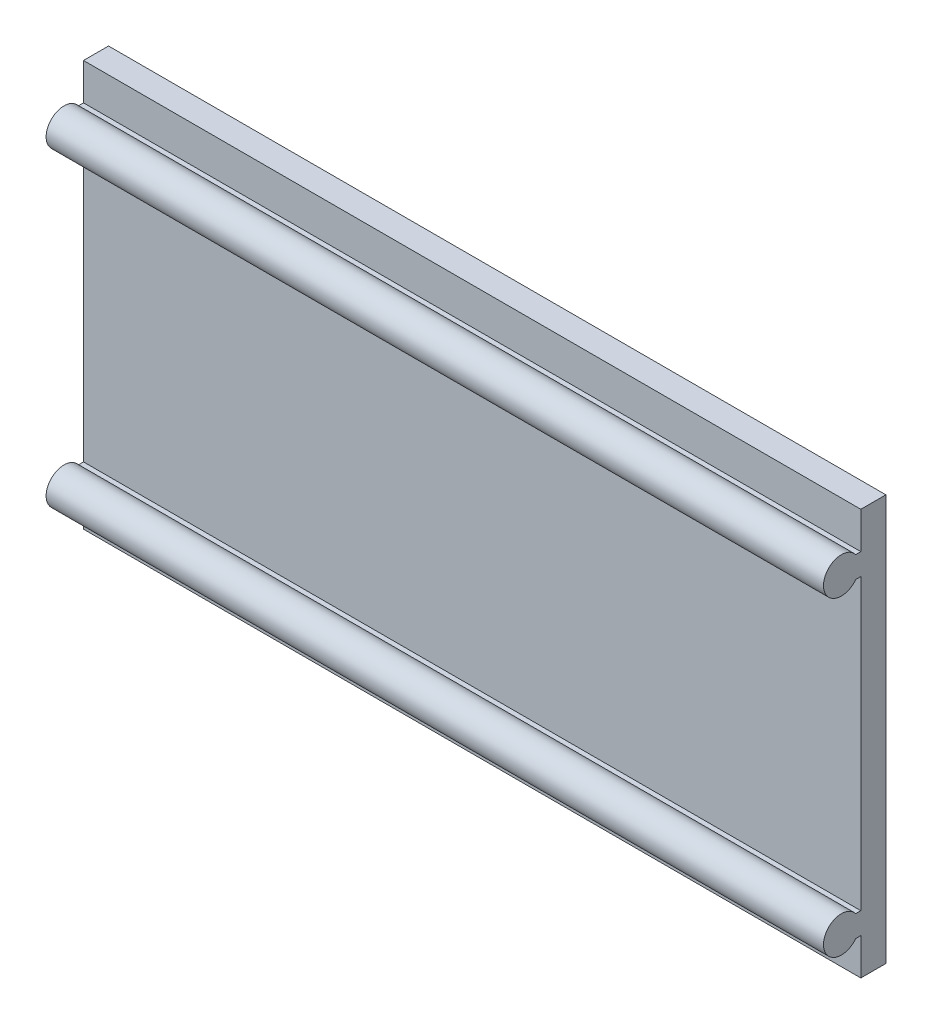
ISO-10303-21;
HEADER;
FILE_DESCRIPTION(('STEP AP214'),'2;1');
FILE_NAME('part.step','',(''),(''),'','','');
FILE_SCHEMA(('AUTOMOTIVE_DESIGN { 1 0 10303 214 1 1 1 1 }'));
ENDSEC;
DATA;
#1=APPLICATION_CONTEXT('core data for automotive mechanical design processes');
#2=APPLICATION_PROTOCOL_DEFINITION('international standard','automotive_design',2000,#1);
#3=PRODUCT_CONTEXT('',#1,'mechanical');
#4=PRODUCT('Part','Part','',(#3));
#5=PRODUCT_RELATED_PRODUCT_CATEGORY('part','',(#4));
#6=PRODUCT_DEFINITION_FORMATION('','',#4);
#7=PRODUCT_DEFINITION_CONTEXT('part definition',#1,'design');
#8=PRODUCT_DEFINITION('design','',#6,#7);
#9=PRODUCT_DEFINITION_SHAPE('','',#8);
#10=(LENGTH_UNIT() NAMED_UNIT(*) SI_UNIT(.MILLI.,.METRE.));
#11=(NAMED_UNIT(*) PLANE_ANGLE_UNIT() SI_UNIT($,.RADIAN.));
#12=(NAMED_UNIT(*) SI_UNIT($,.STERADIAN.) SOLID_ANGLE_UNIT());
#13=UNCERTAINTY_MEASURE_WITH_UNIT(LENGTH_MEASURE(1.E-05),#10,'distance_accuracy_value','');
#14=(GEOMETRIC_REPRESENTATION_CONTEXT(3) GLOBAL_UNCERTAINTY_ASSIGNED_CONTEXT((#13)) GLOBAL_UNIT_ASSIGNED_CONTEXT((#10,
#11,#12)) REPRESENTATION_CONTEXT('',''));
#15=CARTESIAN_POINT('',(0.,0.,0.));
#16=DIRECTION('',(0.,0.,1.));
#17=DIRECTION('',(1.,0.,0.));
#18=AXIS2_PLACEMENT_3D('',#15,#16,#17);
#19=CARTESIAN_POINT('',(0.,-25.7499999999933,-5.49999999999999));
#20=DIRECTION('',(1.,0.,0.));
#21=DIRECTION('',(0.,0.,-1.));
#22=AXIS2_PLACEMENT_3D('',#19,#20,#21);
#23=PLANE('',#22);
#24=DIRECTION('',(0.,0.,1.));
#25=VECTOR('',#24,1.);
#26=CARTESIAN_POINT('',(0.,23.5,8.75));
#27=LINE('',#26,#25);
#28=CARTESIAN_POINT('',(0.,23.5,8.1));
#29=VERTEX_POINT('',#28);
#30=CARTESIAN_POINT('',(0.,23.5,11.));
#31=VERTEX_POINT('',#30);
#32=EDGE_CURVE('E50',#29,#31,#27,.T.);
#33=ORIENTED_EDGE('',*,*,#32,.F.);
#34=DIRECTION('',(0.,1.,0.));
#35=VECTOR('',#34,1.);
#36=CARTESIAN_POINT('',(0.,-23.4999999999933,8.1));
#37=LINE('',#36,#35);
#38=CARTESIAN_POINT('',(0.,-23.4999999999933,8.1));
#39=VERTEX_POINT('',#38);
#40=EDGE_CURVE('E136',#39,#29,#37,.T.);
#41=ORIENTED_EDGE('',*,*,#40,.F.);
#42=DIRECTION('',(0.,0.,-1.));
#43=VECTOR('',#42,1.);
#44=CARTESIAN_POINT('',(0.,-23.4999999999933,11.));
#45=LINE('',#44,#43);
#46=CARTESIAN_POINT('',(0.,-23.4999999999933,11.));
#47=VERTEX_POINT('',#46);
#48=EDGE_CURVE('E124',#47,#39,#45,.T.);
#49=ORIENTED_EDGE('',*,*,#48,.F.);
#50=DIRECTION('',(0.,-1.,0.));
#51=VECTOR('',#50,1.);
#52=CARTESIAN_POINT('',(0.,-19.2499999999933,11.));
#53=LINE('',#52,#51);
#54=CARTESIAN_POINT('',(0.,-19.2499999999933,11.));
#55=VERTEX_POINT('',#54);
#56=EDGE_CURVE('E133',#55,#47,#53,.T.);
#57=ORIENTED_EDGE('',*,*,#56,.F.);
#58=DIRECTION('',(0.,0.,-1.));
#59=VECTOR('',#58,1.);
#60=CARTESIAN_POINT('',(0.,-19.2499999999933,11.5937617924897));
#61=LINE('',#60,#59);
#62=CARTESIAN_POINT('',(0.,-19.2499999999933,11.5937617924897));
#63=VERTEX_POINT('',#62);
#64=EDGE_CURVE('E179',#63,#55,#61,.T.);
#65=ORIENTED_EDGE('',*,*,#64,.F.);
#66=CARTESIAN_POINT('',(0.,-18.,13.2499999999997));
#67=DIRECTION('',(1.,0.,0.));
#68=DIRECTION('',(0.,0.,-1.));
#69=AXIS2_PLACEMENT_3D('',#66,#67,#68);
#70=CIRCLE('',#69,2.07499999999979);
#71=CARTESIAN_POINT('',(0.,-16.7499999999933,11.5937617924998));
#72=VERTEX_POINT('',#71);
#73=EDGE_CURVE('E176',#72,#63,#70,.T.);
#74=ORIENTED_EDGE('',*,*,#73,.F.);
#75=DIRECTION('',(0.,0.,1.));
#76=VECTOR('',#75,1.);
#77=CARTESIAN_POINT('',(0.,-16.7499999999933,11.));
#78=LINE('',#77,#76);
#79=CARTESIAN_POINT('',(0.,-16.7499999999933,11.));
#80=VERTEX_POINT('',#79);
#81=EDGE_CURVE('E173',#80,#72,#78,.T.);
#82=ORIENTED_EDGE('',*,*,#81,.F.);
#83=DIRECTION('',(0.,-1.,0.));
#84=VECTOR('',#83,1.);
#85=CARTESIAN_POINT('',(0.,16.7500000000002,11.));
#86=LINE('',#85,#84);
#87=CARTESIAN_POINT('',(0.,16.7500000000002,11.));
#88=VERTEX_POINT('',#87);
#89=EDGE_CURVE('E170',#88,#80,#86,.T.);
#90=ORIENTED_EDGE('',*,*,#89,.F.);
#91=DIRECTION('',(0.,0.,-1.));
#92=VECTOR('',#91,1.);
#93=CARTESIAN_POINT('',(0.,16.7500000000002,11.5937617924999));
#94=LINE('',#93,#92);
#95=CARTESIAN_POINT('',(0.,16.7500000000002,11.5937617924999));
#96=VERTEX_POINT('',#95);
#97=EDGE_CURVE('E167',#96,#88,#94,.T.);
#98=ORIENTED_EDGE('',*,*,#97,.F.);
#99=CARTESIAN_POINT('',(0.,18.0000000000069,13.25));
#100=DIRECTION('',(1.,0.,0.));
#101=DIRECTION('',(0.,0.,-1.));
#102=AXIS2_PLACEMENT_3D('',#99,#100,#101);
#103=CIRCLE('',#102,2.075);
#104=CARTESIAN_POINT('',(0.,19.2500000000002,11.5937617924898));
#105=VERTEX_POINT('',#104);
#106=EDGE_CURVE('E163',#105,#96,#103,.T.);
#107=ORIENTED_EDGE('',*,*,#106,.F.);
#108=DIRECTION('',(0.,0.,1.));
#109=VECTOR('',#108,1.);
#110=CARTESIAN_POINT('',(0.,19.2500000000002,-6.74999999999998));
#111=LINE('',#110,#109);
#112=CARTESIAN_POINT('',(0.,19.2500000000003,11.));
#113=VERTEX_POINT('',#112);
#114=EDGE_CURVE('E161',#113,#105,#111,.T.);
#115=ORIENTED_EDGE('',*,*,#114,.F.);
#116=DIRECTION('',(0.,-1.,0.));
#117=VECTOR('',#116,1.);
#118=CARTESIAN_POINT('',(0.,27.4500000000069,11.));
#119=LINE('',#118,#117);
#120=EDGE_CURVE('E158',#31,#113,#119,.T.);
#121=ORIENTED_EDGE('',*,*,#120,.F.);
#122=EDGE_LOOP('',(#33,#41,#49,#57,#65,#74,#82,#90,#98,#107,#115,#121));
#123=FACE_BOUND('',#122,.T.);
#124=ADVANCED_FACE('F33',(#123),#23,.F.);
#125=CARTESIAN_POINT('',(90.,-25.7499999999933,-5.49999999999999));
#126=DIRECTION('',(1.,0.,0.));
#127=DIRECTION('',(0.,0.,-1.));
#128=AXIS2_PLACEMENT_3D('',#125,#126,#127);
#129=PLANE('',#128);
#130=DIRECTION('',(0.,0.,-1.));
#131=VECTOR('',#130,1.);
#132=CARTESIAN_POINT('',(90.,-23.4999999999933,11.));
#133=LINE('',#132,#131);
#134=CARTESIAN_POINT('',(90.,-23.4999999999933,11.));
#135=VERTEX_POINT('',#134);
#136=CARTESIAN_POINT('',(90.,-23.4999999999933,8.1));
#137=VERTEX_POINT('',#136);
#138=EDGE_CURVE('E164',#135,#137,#133,.T.);
#139=ORIENTED_EDGE('',*,*,#138,.T.);
#140=DIRECTION('',(0.,-1.,0.));
#141=VECTOR('',#140,1.);
#142=CARTESIAN_POINT('',(90.,23.5,8.1));
#143=LINE('',#142,#141);
#144=CARTESIAN_POINT('',(90.,23.5,8.1));
#145=VERTEX_POINT('',#144);
#146=EDGE_CURVE('E145',#145,#137,#143,.T.);
#147=ORIENTED_EDGE('',*,*,#146,.F.);
#148=DIRECTION('',(0.,0.,1.));
#149=VECTOR('',#148,1.);
#150=CARTESIAN_POINT('',(90.,23.5,8.75));
#151=LINE('',#150,#149);
#152=CARTESIAN_POINT('',(90.,23.5,11.));
#153=VERTEX_POINT('',#152);
#154=EDGE_CURVE('E150',#145,#153,#151,.T.);
#155=ORIENTED_EDGE('',*,*,#154,.T.);
#156=DIRECTION('',(0.,-1.,0.));
#157=VECTOR('',#156,1.);
#158=CARTESIAN_POINT('',(90.,27.4500000000069,11.));
#159=LINE('',#158,#157);
#160=CARTESIAN_POINT('',(90.,19.2500000000002,11.));
#161=VERTEX_POINT('',#160);
#162=EDGE_CURVE('E58',#153,#161,#159,.T.);
#163=ORIENTED_EDGE('',*,*,#162,.T.);
#164=DIRECTION('',(0.,0.,1.));
#165=VECTOR('',#164,1.);
#166=CARTESIAN_POINT('',(90.,19.2500000000002,-6.74999999999998));
#167=LINE('',#166,#165);
#168=CARTESIAN_POINT('',(90.,19.2500000000002,11.5937617924898));
#169=VERTEX_POINT('',#168);
#170=EDGE_CURVE('E160',#161,#169,#167,.T.);
#171=ORIENTED_EDGE('',*,*,#170,.T.);
#172=CARTESIAN_POINT('',(90.,18.0000000000069,13.25));
#173=DIRECTION('',(1.,0.,0.));
#174=DIRECTION('',(0.,0.,-1.));
#175=AXIS2_PLACEMENT_3D('',#172,#173,#174);
#176=CIRCLE('',#175,2.075);
#177=CARTESIAN_POINT('',(90.,16.7500000000002,11.5937617924999));
#178=VERTEX_POINT('',#177);
#179=EDGE_CURVE('E184',#169,#178,#176,.T.);
#180=ORIENTED_EDGE('',*,*,#179,.T.);
#181=DIRECTION('',(0.,0.,-1.));
#182=VECTOR('',#181,1.);
#183=CARTESIAN_POINT('',(90.,16.7500000000002,11.5937617924999));
#184=LINE('',#183,#182);
#185=CARTESIAN_POINT('',(90.,16.7500000000002,11.));
#186=VERTEX_POINT('',#185);
#187=EDGE_CURVE('E187',#178,#186,#184,.T.);
#188=ORIENTED_EDGE('',*,*,#187,.T.);
#189=DIRECTION('',(0.,-1.,0.));
#190=VECTOR('',#189,1.);
#191=CARTESIAN_POINT('',(90.,16.7500000000002,11.));
#192=LINE('',#191,#190);
#193=CARTESIAN_POINT('',(90.,-16.7499999999933,11.));
#194=VERTEX_POINT('',#193);
#195=EDGE_CURVE('E190',#186,#194,#192,.T.);
#196=ORIENTED_EDGE('',*,*,#195,.T.);
#197=DIRECTION('',(0.,0.,1.));
#198=VECTOR('',#197,1.);
#199=CARTESIAN_POINT('',(90.,-16.7499999999933,11.));
#200=LINE('',#199,#198);
#201=CARTESIAN_POINT('',(90.,-16.7499999999933,11.5937617924998));
#202=VERTEX_POINT('',#201);
#203=EDGE_CURVE('E193',#194,#202,#200,.T.);
#204=ORIENTED_EDGE('',*,*,#203,.T.);
#205=CARTESIAN_POINT('',(90.,-18.,13.2499999999997));
#206=DIRECTION('',(1.,0.,0.));
#207=DIRECTION('',(0.,0.,-1.));
#208=AXIS2_PLACEMENT_3D('',#205,#206,#207);
#209=CIRCLE('',#208,2.07499999999979);
#210=CARTESIAN_POINT('',(90.,-19.2499999999933,11.5937617924897));
#211=VERTEX_POINT('',#210);
#212=EDGE_CURVE('E196',#202,#211,#209,.T.);
#213=ORIENTED_EDGE('',*,*,#212,.T.);
#214=DIRECTION('',(0.,0.,-1.));
#215=VECTOR('',#214,1.);
#216=CARTESIAN_POINT('',(90.,-19.2499999999933,11.5937617924897));
#217=LINE('',#216,#215);
#218=CARTESIAN_POINT('',(90.,-19.2499999999933,11.));
#219=VERTEX_POINT('',#218);
#220=EDGE_CURVE('E199',#211,#219,#217,.T.);
#221=ORIENTED_EDGE('',*,*,#220,.T.);
#222=DIRECTION('',(0.,-1.,0.));
#223=VECTOR('',#222,1.);
#224=CARTESIAN_POINT('',(90.,-19.2499999999933,11.));
#225=LINE('',#224,#223);
#226=EDGE_CURVE('E202',#219,#135,#225,.T.);
#227=ORIENTED_EDGE('',*,*,#226,.T.);
#228=EDGE_LOOP('',(#139,#147,#155,#163,#171,#180,#188,#196,#204,#213,#221,#227));
#229=FACE_BOUND('',#228,.T.);
#230=ADVANCED_FACE('F226',(#229),#129,.T.);
#231=CARTESIAN_POINT('',(0.,19.2500000000002,-6.74999999999998));
#232=DIRECTION('',(0.,1.,0.));
#233=DIRECTION('',(0.,0.,1.));
#234=AXIS2_PLACEMENT_3D('',#231,#232,#233);
#235=PLANE('',#234);
#236=ORIENTED_EDGE('',*,*,#170,.F.);
#237=DIRECTION('',(1.,0.,0.));
#238=VECTOR('',#237,1.);
#239=CARTESIAN_POINT('',(90.,19.2500000000003,11.));
#240=LINE('',#239,#238);
#241=EDGE_CURVE('E155',#113,#161,#240,.T.);
#242=ORIENTED_EDGE('',*,*,#241,.F.);
#243=ORIENTED_EDGE('',*,*,#114,.T.);
#244=DIRECTION('',(1.,0.,0.));
#245=VECTOR('',#244,1.);
#246=CARTESIAN_POINT('',(0.,19.2500000000002,11.5937617924898));
#247=LINE('',#246,#245);
#248=EDGE_CURVE('E37',#105,#169,#247,.T.);
#249=ORIENTED_EDGE('',*,*,#248,.T.);
#250=EDGE_LOOP('',(#236,#242,#243,#249));
#251=FACE_BOUND('',#250,.T.);
#252=ADVANCED_FACE('F35',(#251),#235,.T.);
#253=CARTESIAN_POINT('',(0.,-23.4999999999933,11.));
#254=DIRECTION('',(0.,-1.,0.));
#255=DIRECTION('',(0.,0.,-1.));
#256=AXIS2_PLACEMENT_3D('',#253,#254,#255);
#257=PLANE('',#256);
#258=ORIENTED_EDGE('',*,*,#48,.T.);
#259=DIRECTION('',(-1.,0.,0.));
#260=VECTOR('',#259,1.);
#261=CARTESIAN_POINT('',(90.,-23.4999999999933,8.1));
#262=LINE('',#261,#260);
#263=EDGE_CURVE('E129',#137,#39,#262,.T.);
#264=ORIENTED_EDGE('',*,*,#263,.F.);
#265=ORIENTED_EDGE('',*,*,#138,.F.);
#266=DIRECTION('',(1.,0.,0.));
#267=VECTOR('',#266,1.);
#268=CARTESIAN_POINT('',(0.,-23.4999999999933,11.));
#269=LINE('',#268,#267);
#270=EDGE_CURVE('E11',#47,#135,#269,.T.);
#271=ORIENTED_EDGE('',*,*,#270,.F.);
#272=EDGE_LOOP('',(#258,#264,#265,#271));
#273=FACE_BOUND('',#272,.T.);
#274=ADVANCED_FACE('F126',(#273),#257,.T.);
#275=CARTESIAN_POINT('',(0.,-19.2499999999933,11.));
#276=DIRECTION('',(0.,0.,1.));
#277=DIRECTION('',(1.,0.,0.));
#278=AXIS2_PLACEMENT_3D('',#275,#276,#277);
#279=PLANE('',#278);
#280=ORIENTED_EDGE('',*,*,#226,.F.);
#281=DIRECTION('',(1.,0.,0.));
#282=VECTOR('',#281,1.);
#283=CARTESIAN_POINT('',(0.,-19.2499999999933,11.));
#284=LINE('',#283,#282);
#285=EDGE_CURVE('E42',#55,#219,#284,.T.);
#286=ORIENTED_EDGE('',*,*,#285,.F.);
#287=ORIENTED_EDGE('',*,*,#56,.T.);
#288=ORIENTED_EDGE('',*,*,#270,.T.);
#289=EDGE_LOOP('',(#280,#286,#287,#288));
#290=FACE_BOUND('',#289,.T.);
#291=ADVANCED_FACE('F248',(#290),#279,.T.);
#292=CARTESIAN_POINT('',(0.,-19.2499999999933,11.5937617924897));
#293=DIRECTION('',(0.,-1.,0.));
#294=DIRECTION('',(0.,0.,-1.));
#295=AXIS2_PLACEMENT_3D('',#292,#293,#294);
#296=PLANE('',#295);
#297=ORIENTED_EDGE('',*,*,#220,.F.);
#298=DIRECTION('',(1.,0.,0.));
#299=VECTOR('',#298,1.);
#300=CARTESIAN_POINT('',(0.,-19.2499999999933,11.5937617924897));
#301=LINE('',#300,#299);
#302=EDGE_CURVE('E207',#63,#211,#301,.T.);
#303=ORIENTED_EDGE('',*,*,#302,.F.);
#304=ORIENTED_EDGE('',*,*,#64,.T.);
#305=ORIENTED_EDGE('',*,*,#285,.T.);
#306=EDGE_LOOP('',(#297,#303,#304,#305));
#307=FACE_BOUND('',#306,.T.);
#308=ADVANCED_FACE('F245',(#307),#296,.T.);
#309=CARTESIAN_POINT('',(0.,-18.,13.2499999999997));
#310=DIRECTION('',(1.,0.,0.));
#311=DIRECTION('',(0.,0.,-1.));
#312=AXIS2_PLACEMENT_3D('',#309,#310,#311);
#313=CYLINDRICAL_SURFACE('',#312,2.07499999999979);
#314=ORIENTED_EDGE('',*,*,#212,.F.);
#315=DIRECTION('',(1.,0.,0.));
#316=VECTOR('',#315,1.);
#317=CARTESIAN_POINT('',(0.,-16.7499999999933,11.5937617924998));
#318=LINE('',#317,#316);
#319=EDGE_CURVE('E209',#72,#202,#318,.T.);
#320=ORIENTED_EDGE('',*,*,#319,.F.);
#321=ORIENTED_EDGE('',*,*,#73,.T.);
#322=ORIENTED_EDGE('',*,*,#302,.T.);
#323=EDGE_LOOP('',(#314,#320,#321,#322));
#324=FACE_BOUND('',#323,.T.);
#325=ADVANCED_FACE('F241',(#324),#313,.T.);
#326=CARTESIAN_POINT('',(0.,-16.7499999999933,11.));
#327=DIRECTION('',(0.,1.,0.));
#328=DIRECTION('',(0.,0.,1.));
#329=AXIS2_PLACEMENT_3D('',#326,#327,#328);
#330=PLANE('',#329);
#331=ORIENTED_EDGE('',*,*,#203,.F.);
#332=DIRECTION('',(1.,0.,0.));
#333=VECTOR('',#332,1.);
#334=CARTESIAN_POINT('',(0.,-16.7499999999933,11.));
#335=LINE('',#334,#333);
#336=EDGE_CURVE('E211',#80,#194,#335,.T.);
#337=ORIENTED_EDGE('',*,*,#336,.F.);
#338=ORIENTED_EDGE('',*,*,#81,.T.);
#339=ORIENTED_EDGE('',*,*,#319,.T.);
#340=EDGE_LOOP('',(#331,#337,#338,#339));
#341=FACE_BOUND('',#340,.T.);
#342=ADVANCED_FACE('F237',(#341),#330,.T.);
#343=CARTESIAN_POINT('',(0.,16.7500000000002,11.));
#344=DIRECTION('',(0.,0.,1.));
#345=DIRECTION('',(0.,-1.,0.));
#346=AXIS2_PLACEMENT_3D('',#343,#344,#345);
#347=PLANE('',#346);
#348=ORIENTED_EDGE('',*,*,#195,.F.);
#349=DIRECTION('',(1.,0.,0.));
#350=VECTOR('',#349,1.);
#351=CARTESIAN_POINT('',(0.,16.7500000000002,11.));
#352=LINE('',#351,#350);
#353=EDGE_CURVE('E213',#88,#186,#352,.T.);
#354=ORIENTED_EDGE('',*,*,#353,.F.);
#355=ORIENTED_EDGE('',*,*,#89,.T.);
#356=ORIENTED_EDGE('',*,*,#336,.T.);
#357=EDGE_LOOP('',(#348,#354,#355,#356));
#358=FACE_BOUND('',#357,.T.);
#359=ADVANCED_FACE('F233',(#358),#347,.T.);
#360=CARTESIAN_POINT('',(0.,16.7500000000002,11.5937617924999));
#361=DIRECTION('',(0.,-1.,0.));
#362=DIRECTION('',(0.,0.,-1.));
#363=AXIS2_PLACEMENT_3D('',#360,#361,#362);
#364=PLANE('',#363);
#365=ORIENTED_EDGE('',*,*,#187,.F.);
#366=DIRECTION('',(1.,0.,0.));
#367=VECTOR('',#366,1.);
#368=CARTESIAN_POINT('',(0.,16.7500000000002,11.5937617924999));
#369=LINE('',#368,#367);
#370=EDGE_CURVE('E214',#96,#178,#369,.T.);
#371=ORIENTED_EDGE('',*,*,#370,.F.);
#372=ORIENTED_EDGE('',*,*,#97,.T.);
#373=ORIENTED_EDGE('',*,*,#353,.T.);
#374=EDGE_LOOP('',(#365,#371,#372,#373));
#375=FACE_BOUND('',#374,.T.);
#376=ADVANCED_FACE('F229',(#375),#364,.T.);
#377=CARTESIAN_POINT('',(0.,18.0000000000069,13.25));
#378=DIRECTION('',(1.,0.,0.));
#379=DIRECTION('',(0.,0.,-1.));
#380=AXIS2_PLACEMENT_3D('',#377,#378,#379);
#381=CYLINDRICAL_SURFACE('',#380,2.075);
#382=ORIENTED_EDGE('',*,*,#179,.F.);
#383=ORIENTED_EDGE('',*,*,#248,.F.);
#384=ORIENTED_EDGE('',*,*,#106,.T.);
#385=ORIENTED_EDGE('',*,*,#370,.T.);
#386=EDGE_LOOP('',(#382,#383,#384,#385));
#387=FACE_BOUND('',#386,.T.);
#388=ADVANCED_FACE('F225',(#387),#381,.T.);
#389=CARTESIAN_POINT('',(90.,27.4500000000069,11.));
#390=DIRECTION('',(0.,0.,-1.));
#391=DIRECTION('',(0.,1.,0.));
#392=AXIS2_PLACEMENT_3D('',#389,#390,#391);
#393=PLANE('',#392);
#394=ORIENTED_EDGE('',*,*,#162,.F.);
#395=DIRECTION('',(-1.,0.,0.));
#396=VECTOR('',#395,1.);
#397=CARTESIAN_POINT('',(90.,23.5,11.));
#398=LINE('',#397,#396);
#399=EDGE_CURVE('E152',#153,#31,#398,.T.);
#400=ORIENTED_EDGE('',*,*,#399,.T.);
#401=ORIENTED_EDGE('',*,*,#120,.T.);
#402=ORIENTED_EDGE('',*,*,#241,.T.);
#403=EDGE_LOOP('',(#394,#400,#401,#402));
#404=FACE_BOUND('',#403,.T.);
#405=ADVANCED_FACE('F251',(#404),#393,.F.);
#406=CARTESIAN_POINT('',(90.,23.5,8.75));
#407=DIRECTION('',(0.,-1.,0.));
#408=DIRECTION('',(0.,0.,-1.));
#409=AXIS2_PLACEMENT_3D('',#406,#407,#408);
#410=PLANE('',#409);
#411=ORIENTED_EDGE('',*,*,#154,.F.);
#412=DIRECTION('',(1.,0.,0.));
#413=VECTOR('',#412,1.);
#414=CARTESIAN_POINT('',(0.,23.5,8.1));
#415=LINE('',#414,#413);
#416=EDGE_CURVE('E140',#29,#145,#415,.T.);
#417=ORIENTED_EDGE('',*,*,#416,.F.);
#418=ORIENTED_EDGE('',*,*,#32,.T.);
#419=ORIENTED_EDGE('',*,*,#399,.F.);
#420=EDGE_LOOP('',(#411,#417,#418,#419));
#421=FACE_BOUND('',#420,.T.);
#422=ADVANCED_FACE('F249',(#421),#410,.F.);
#423=CARTESIAN_POINT('',(0.,0.,8.1));
#424=DIRECTION('',(0.,0.,-1.));
#425=DIRECTION('',(-1.,0.,0.));
#426=AXIS2_PLACEMENT_3D('',#423,#424,#425);
#427=PLANE('',#426);
#428=ORIENTED_EDGE('',*,*,#263,.T.);
#429=ORIENTED_EDGE('',*,*,#40,.T.);
#430=ORIENTED_EDGE('',*,*,#416,.T.);
#431=ORIENTED_EDGE('',*,*,#146,.T.);
#432=EDGE_LOOP('',(#428,#429,#430,#431));
#433=FACE_BOUND('',#432,.T.);
#434=ADVANCED_FACE('F143',(#433),#427,.T.);
#435=CLOSED_SHELL('',(#124,#230,#252,#274,#291,#308,#325,#342,#359,#376,#388,#405,#422,#434));
#436=MANIFOLD_SOLID_BREP('B2',#435);
#437=ADVANCED_BREP_SHAPE_REPRESENTATION('',(#18,#436),#14);
#438=SHAPE_DEFINITION_REPRESENTATION(#9,#437);
ENDSEC;
END-ISO-10303-21;
